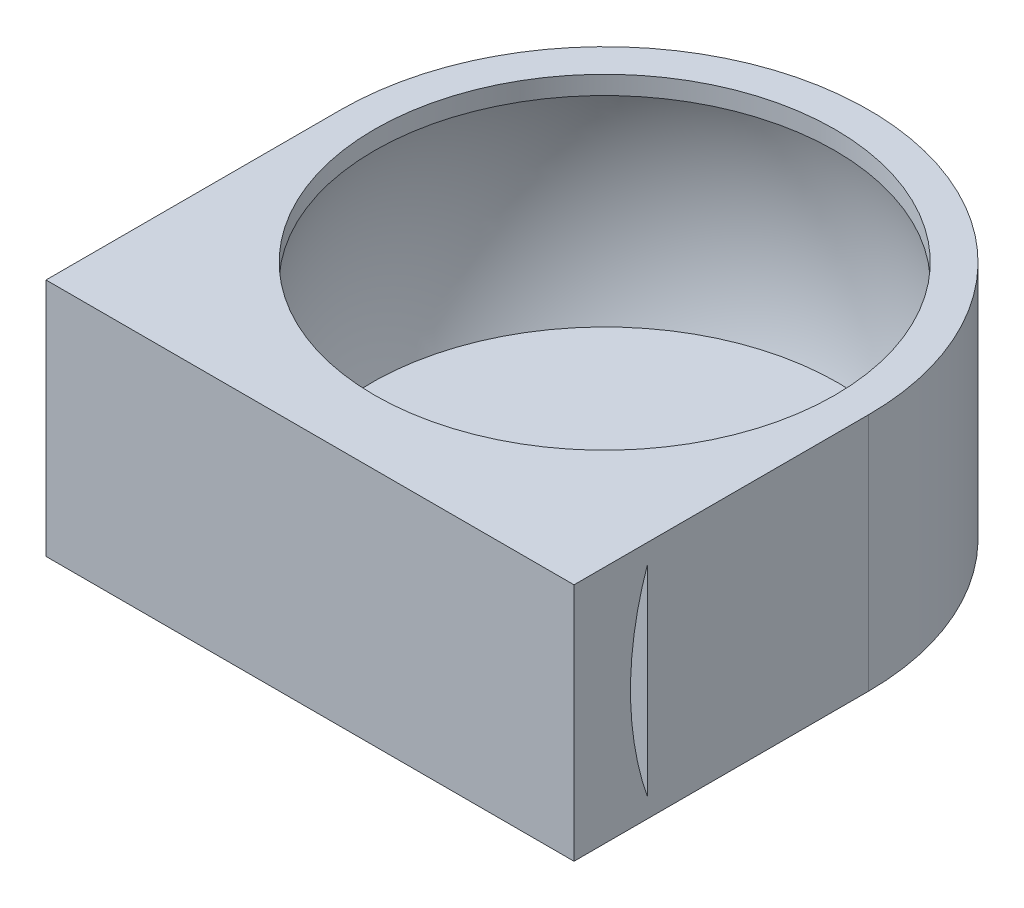
ISO-10303-21;
HEADER;
FILE_DESCRIPTION(('STEP AP214'),'2;1');
FILE_NAME('part.step','',(''),(''),'','','');
FILE_SCHEMA(('AUTOMOTIVE_DESIGN { 1 0 10303 214 1 1 1 1 }'));
ENDSEC;
DATA;
#1=APPLICATION_CONTEXT('core data for automotive mechanical design processes');
#2=APPLICATION_PROTOCOL_DEFINITION('international standard','automotive_design',2000,#1);
#3=PRODUCT_CONTEXT('',#1,'mechanical');
#4=PRODUCT('Part','Part','',(#3));
#5=PRODUCT_RELATED_PRODUCT_CATEGORY('part','',(#4));
#6=PRODUCT_DEFINITION_FORMATION('','',#4);
#7=PRODUCT_DEFINITION_CONTEXT('part definition',#1,'design');
#8=PRODUCT_DEFINITION('design','',#6,#7);
#9=PRODUCT_DEFINITION_SHAPE('','',#8);
#10=(LENGTH_UNIT() NAMED_UNIT(*) SI_UNIT(.MILLI.,.METRE.));
#11=(NAMED_UNIT(*) PLANE_ANGLE_UNIT() SI_UNIT($,.RADIAN.));
#12=(NAMED_UNIT(*) SI_UNIT($,.STERADIAN.) SOLID_ANGLE_UNIT());
#13=UNCERTAINTY_MEASURE_WITH_UNIT(LENGTH_MEASURE(1.E-05),#10,'distance_accuracy_value','');
#14=(GEOMETRIC_REPRESENTATION_CONTEXT(3) GLOBAL_UNCERTAINTY_ASSIGNED_CONTEXT((#13)) GLOBAL_UNIT_ASSIGNED_CONTEXT((#10,
#11,#12)) REPRESENTATION_CONTEXT('',''));
#15=CARTESIAN_POINT('',(0.,0.,0.));
#16=DIRECTION('',(0.,0.,1.));
#17=DIRECTION('',(1.,0.,0.));
#18=AXIS2_PLACEMENT_3D('',#15,#16,#17);
#19=CARTESIAN_POINT('',(0.,16.,0.));
#20=DIRECTION('',(0.,-1.,0.));
#21=DIRECTION('',(0.,0.,-1.));
#22=AXIS2_PLACEMENT_3D('',#19,#20,#21);
#23=DEGENERATE_TOROIDAL_SURFACE('',#22,9.19904660054057,50.,.F.);
#24=CARTESIAN_POINT('',(0.,-0.5,0.));
#25=DIRECTION('',(0.,-1.,0.));
#26=DIRECTION('',(0.,0.,-1.));
#27=AXIS2_PLACEMENT_3D('',#24,#25,#26);
#28=CIRCLE('',#27,38.);
#29=CARTESIAN_POINT('',(12.1655250605964,-0.5,36.));
#30=VERTEX_POINT('',#29);
#31=EDGE_CURVE('E106',#30,#30,#28,.T.);
#32=ORIENTED_EDGE('',*,*,#31,.T.);
#33=CARTESIAN_POINT('',(19.2020258906413,16.,36.));
#34=CARTESIAN_POINT('',(19.2020310457003,16.6057772933491,36.));
#35=CARTESIAN_POINT('',(19.1786348506415,17.2114373889956,36.));
#36=CARTESIAN_POINT('',(19.0851223311847,18.4192845924178,36.));
#37=CARTESIAN_POINT('',(19.015000030516,19.0214712460015,36.));
#38=CARTESIAN_POINT('',(18.8281585129186,20.2189906502389,36.));
#39=CARTESIAN_POINT('',(18.7114070435231,20.8143183628509,36.));
#40=CARTESIAN_POINT('',(18.4316559780078,21.9940034547397,36.));
#41=CARTESIAN_POINT('',(18.2686578131995,22.5783611729354,36.));
#42=CARTESIAN_POINT('',(17.8966662842177,23.7331064868995,36.));
#43=CARTESIAN_POINT('',(17.6876132534174,24.3034748835193,36.));
#44=CARTESIAN_POINT('',(17.224394446501,25.4253719148372,36.));
#45=CARTESIAN_POINT('',(16.9702448647637,25.9769072280827,36.));
#46=CARTESIAN_POINT('',(16.4175190451533,27.0576373772618,36.));
#47=CARTESIAN_POINT('',(16.1189200989225,27.5868206154913,36.));
#48=CARTESIAN_POINT('',(15.4786515673055,28.6181944875166,36.));
#49=CARTESIAN_POINT('',(15.1369992192345,29.120395809933,36.));
#50=CARTESIAN_POINT('',(14.4005366008495,30.1090713047297,36.));
#51=CARTESIAN_POINT('',(14.0043925660099,30.5945543133251,36.));
#52=CARTESIAN_POINT('',(13.1698473486968,31.5274064187738,36.));
#53=CARTESIAN_POINT('',(12.7314649283707,31.9747922734061,36.));
#54=CARTESIAN_POINT('',(11.8148015711599,32.8266630259533,36.));
#55=CARTESIAN_POINT('',(11.336522536994,33.2311499676828,36.));
#56=CARTESIAN_POINT('',(10.3431880469997,33.9921255936865,36.));
#57=CARTESIAN_POINT('',(9.8281373698027,34.3486204974179,36.));
#58=CARTESIAN_POINT('',(8.81556469579062,34.9772871848256,36.));
#59=CARTESIAN_POINT('',(8.32101446462476,35.2542499469128,36.));
#60=CARTESIAN_POINT('',(7.30841864839705,35.7611783230764,36.));
#61=CARTESIAN_POINT('',(6.79037685567763,35.9911514901117,36.));
#62=CARTESIAN_POINT('',(5.7351622215878,36.4007375245693,36.));
#63=CARTESIAN_POINT('',(5.19800376453149,36.5803873910334,36.));
#64=CARTESIAN_POINT('',(4.10880710859047,36.886787734938,36.));
#65=CARTESIAN_POINT('',(3.55677046416693,37.0135437160555,36.));
#66=CARTESIAN_POINT('',(2.5027795770476,37.2014437861316,36.));
#67=CARTESIAN_POINT('',(2.00181433111471,37.2681726250191,36.));
#68=CARTESIAN_POINT('',(0.995958073071651,37.3569696381367,36.));
#69=CARTESIAN_POINT('',(0.491067394281339,37.3790415636221,36.));
#70=CARTESIAN_POINT('',(-0.518537517793075,37.3782244643305,36.));
#71=CARTESIAN_POINT('',(-1.0232517624426,37.355347321312,36.));
#72=CARTESIAN_POINT('',(-2.02866447753262,37.2649714713521,36.));
#73=CARTESIAN_POINT('',(-2.52936298915714,37.1974732226236,36.));
#74=CARTESIAN_POINT('',(-3.49845824206951,37.023167868982,36.));
#75=CARTESIAN_POINT('',(-3.96723360102951,36.9184543989569,36.));
#76=CARTESIAN_POINT('',(-4.89471025013053,36.6707076150309,36.));
#77=CARTESIAN_POINT('',(-5.35340799297806,36.5276610346019,36.));
#78=CARTESIAN_POINT('',(-6.25761011427886,36.2048906946893,36.));
#79=CARTESIAN_POINT('',(-6.7031165216229,36.0251726093668,36.));
#80=CARTESIAN_POINT('',(-7.57846100241884,35.6309177364834,36.));
#81=CARTESIAN_POINT('',(-8.00829782983967,35.4163781873147,36.));
#82=CARTESIAN_POINT('',(-8.86609271821652,34.9457392840267,36.));
#83=CARTESIAN_POINT('',(-9.29335076801636,34.6883646803351,36.));
#84=CARTESIAN_POINT('',(-10.1262889567695,34.1408112382138,36.));
#85=CARTESIAN_POINT('',(-10.531968213308,33.8506310597903,36.));
#86=CARTESIAN_POINT('',(-11.3198794915532,33.240007061729,36.));
#87=CARTESIAN_POINT('',(-11.7021102609797,32.9195616280746,36.));
#88=CARTESIAN_POINT('',(-12.4416468038312,32.2508725543998,36.));
#89=CARTESIAN_POINT('',(-12.7989431112084,31.9026184636082,36.));
#90=CARTESIAN_POINT('',(-13.5192148639272,31.1473072663814,36.));
#91=CARTESIAN_POINT('',(-13.8796171507483,30.7377946265215,36.));
#92=CARTESIAN_POINT('',(-14.5675430087174,29.8918187213419,36.));
#93=CARTESIAN_POINT('',(-14.8950541256043,29.4553453476021,36.));
#94=CARTESIAN_POINT('',(-15.5158788510139,28.5587514749859,36.));
#95=CARTESIAN_POINT('',(-15.8091930468688,28.0986313824375,36.));
#96=CARTESIAN_POINT('',(-16.3607692409398,27.1576544290779,36.));
#97=CARTESIAN_POINT('',(-16.6190186507655,26.6767902022527,36.));
#98=CARTESIAN_POINT('',(-17.1238084705346,25.6480542288699,36.));
#99=CARTESIAN_POINT('',(-17.366545861077,25.0983134367653,36.));
#100=CARTESIAN_POINT('',(-17.8076605590503,23.9813030677111,36.));
#101=CARTESIAN_POINT('',(-18.0060345886711,23.4140321990646,36.));
#102=CARTESIAN_POINT('',(-18.3578651268353,22.2654666364258,36.));
#103=CARTESIAN_POINT('',(-18.5113020636536,21.6841659508918,36.));
#104=CARTESIAN_POINT('',(-18.7726463416149,20.5116116457317,36.));
#105=CARTESIAN_POINT('',(-18.8805664397573,19.9203608631927,36.));
#106=CARTESIAN_POINT('',(-19.0568125768183,18.6880840153806,36.));
#107=CARTESIAN_POINT('',(-19.1216920772801,18.0465626888334,36.));
#108=CARTESIAN_POINT('',(-19.1985664760207,16.7603600020624,36.));
#109=CARTESIAN_POINT('',(-19.210560143055,16.1156785686173,36.));
#110=CARTESIAN_POINT('',(-19.1816206769267,14.8273477199929,36.));
#111=CARTESIAN_POINT('',(-19.14067513723,14.1836985821353,36.));
#112=CARTESIAN_POINT('',(-19.0059683578127,12.9019605625643,36.));
#113=CARTESIAN_POINT('',(-18.912208002071,12.2638715879702,36.));
#114=CARTESIAN_POINT('',(-18.669137142463,10.9816080560534,36.));
#115=CARTESIAN_POINT('',(-18.518481784378,10.3376876845696,36.));
#116=CARTESIAN_POINT('',(-18.1625718945964,9.06537379604852,36.));
#117=CARTESIAN_POINT('',(-17.9573388316294,8.43697427970828,36.));
#118=CARTESIAN_POINT('',(-17.4928927845747,7.2000553506321,36.));
#119=CARTESIAN_POINT('',(-17.2336523044851,6.59154624768481,36.));
#120=CARTESIAN_POINT('',(-16.6624212452572,5.40012081151381,36.));
#121=CARTESIAN_POINT('',(-16.3504556651347,4.81719251366825,36.));
#122=CARTESIAN_POINT('',(-15.6852377881774,3.6990257846357,36.));
#123=CARTESIAN_POINT('',(-15.3335120802379,3.16287977282287,36.));
#124=CARTESIAN_POINT('',(-14.5834184502506,2.1245924882465,36.));
#125=CARTESIAN_POINT('',(-14.1850726457124,1.62243526755772,36.));
#126=CARTESIAN_POINT('',(-13.3436909023628,0.657093303386652,36.));
#127=CARTESIAN_POINT('',(-12.9006593108956,0.193904776784683,36.));
#128=CARTESIAN_POINT('',(-11.9724765483436,-0.688174618883414,36.));
#129=CARTESIAN_POINT('',(-11.4873298082683,-1.10707013783413,36.));
#130=CARTESIAN_POINT('',(-10.5212980737313,-1.86147191619371,36.));
#131=CARTESIAN_POINT('',(-10.0435870115926,-2.20104449096194,36.));
#132=CARTESIAN_POINT('',(-9.05877731954651,-2.83444234932587,36.));
#133=CARTESIAN_POINT('',(-8.55168358465904,-3.12827522305109,36.));
#134=CARTESIAN_POINT('',(-7.51213129954466,-3.66606785847515,36.));
#135=CARTESIAN_POINT('',(-6.97969146062403,-3.91006372844616,36.));
#136=CARTESIAN_POINT('',(-5.89348991511576,-4.34478808852486,36.));
#137=CARTESIAN_POINT('',(-5.33973079069959,-4.53552300659677,36.));
#138=CARTESIAN_POINT('',(-4.27862828195593,-4.84251389496441,36.));
#139=CARTESIAN_POINT('',(-3.77299500133515,-4.96470341271397,36.));
#140=CARTESIAN_POINT('',(-2.75277119549913,-5.16295392641704,36.));
#141=CARTESIAN_POINT('',(-2.23818142976298,-5.23901881416532,36.));
#142=CARTESIAN_POINT('',(-1.20442515993808,-5.34391816015698,36.));
#143=CARTESIAN_POINT('',(-0.685260652670598,-5.37277228933131,36.));
#144=CARTESIAN_POINT('',(0.353527497047721,-5.38288907550793,36.));
#145=CARTESIAN_POINT('',(0.873151122734077,-5.3641534038206,36.));
#146=CARTESIAN_POINT('',(1.87152011033415,-5.2824054065093,36.));
#147=CARTESIAN_POINT('',(2.35053569874671,-5.22264918817279,36.));
#148=CARTESIAN_POINT('',(3.30185533031695,-5.0630898896812,36.));
#149=CARTESIAN_POINT('',(3.77415928041526,-4.96328625481366,36.));
#150=CARTESIAN_POINT('',(4.70881773788836,-4.72483097941358,36.));
#151=CARTESIAN_POINT('',(5.17117262463391,-4.58618082298624,36.));
#152=CARTESIAN_POINT('',(6.08301711385637,-4.27160635912483,36.));
#153=CARTESIAN_POINT('',(6.53250631537181,-4.09568089143132,36.));
#154=CARTESIAN_POINT('',(7.42252429951935,-3.70555313063083,36.));
#155=CARTESIAN_POINT('',(7.86282025870618,-3.49082027660547,36.));
#156=CARTESIAN_POINT('',(8.72509770435343,-3.02701490532951,36.));
#157=CARTESIAN_POINT('',(9.14707299514659,-2.77793088834891,36.));
#158=CARTESIAN_POINT('',(9.97035757498657,-2.24786066069178,36.));
#159=CARTESIAN_POINT('',(10.3716703958397,-1.96687992856485,36.));
#160=CARTESIAN_POINT('',(11.1520285209999,-1.37529112811645,36.));
#161=CARTESIAN_POINT('',(11.5310653523474,-1.06467190276804,36.));
#162=CARTESIAN_POINT('',(12.2954763878964,-0.389557939860087,36.));
#163=CARTESIAN_POINT('',(12.6787931982912,-0.0227326056363834,36.));
#164=CARTESIAN_POINT('',(13.4158280857092,0.739750638466436,36.));
#165=CARTESIAN_POINT('',(13.7695350727556,1.1354192483423,36.));
#166=CARTESIAN_POINT('',(14.4459006305312,1.95252477806954,36.));
#167=CARTESIAN_POINT('',(14.7685550564841,2.37396512558964,36.));
#168=CARTESIAN_POINT('',(15.3817590624581,3.23978190616565,36.));
#169=CARTESIAN_POINT('',(15.672296837165,3.68416668557371,36.));
#170=CARTESIAN_POINT('',(16.2485272531455,4.63983169776703,36.));
#171=CARTESIAN_POINT('',(16.5306249274475,5.15328248694689,36.));
#172=CARTESIAN_POINT('',(17.0536007526307,6.20098912907179,36.));
#173=CARTESIAN_POINT('',(17.294461519254,6.73525364052811,36.));
#174=CARTESIAN_POINT('',(17.7338991751329,7.820441996062,36.));
#175=CARTESIAN_POINT('',(17.932507084175,8.37135327725957,36.));
#176=CARTESIAN_POINT('',(18.2870877161819,9.48676400319322,36.));
#177=CARTESIAN_POINT('',(18.4430523633796,10.0512659997408,36.));
#178=CARTESIAN_POINT('',(18.7851646816936,11.5011774679944,36.));
#179=CARTESIAN_POINT('',(18.9414313628985,12.393799066886,36.));
#180=CARTESIAN_POINT('',(19.1498562014607,14.1910344716028,36.));
#181=CARTESIAN_POINT('',(19.2020181947624,15.0956478343312,36.));
#182=CARTESIAN_POINT('',(19.2020258906413,16.,36.));
#183=B_SPLINE_CURVE_WITH_KNOTS('',3,(#33,#34,#35,#36,#37,#38,#39,#40,#41,#42,#43,#44,#45,#46,
#47,#48,#49,#50,#51,#52,#53,#54,#55,#56,#57,#58,#59,#60,#61,#62,#63,#64,#65,#66,#67,#68,#69,#70,
#71,#72,#73,#74,#75,#76,#77,#78,#79,#80,#81,#82,#83,#84,#85,#86,#87,#88,#89,#90,#91,#92,#93,#94,
#95,#96,#97,#98,#99,#100,#101,#102,#103,#104,#105,#106,#107,#108,#109,#110,#111,#112,#113,#114,
#115,#116,#117,#118,#119,#120,#121,#122,#123,#124,#125,#126,#127,#128,#129,#130,#131,#132,#133,
#134,#135,#136,#137,#138,#139,#140,#141,#142,#143,#144,#145,#146,#147,#148,#149,#150,#151,#152,
#153,#154,#155,#156,#157,#158,#159,#160,#161,#162,#163,#164,#165,#166,#167,#168,#169,#170,#171,
#172,#173,#174,#175,#176,#177,#178,#179,#180,#181,#182),.UNSPECIFIED.,.T.,.F.,(4,2,2,2,2,2,2,2,
2,2,2,2,2,2,2,2,2,2,2,2,2,2,2,2,2,2,2,2,2,2,2,2,2,2,2,2,2,2,2,2,2,2,2,2,2,2,2,2,2,2,2,2,2,2,2,2,
2,2,2,2,2,2,2,2,2,2,2,2,2,2,2,2,2,2,4),(0.,1.81667705231358,3.63358650229733,5.45175485484635,
7.26986694216211,9.09034849320725,10.9101776191455,12.730939673286,14.5509750502704,
16.4282434746547,18.3046818337628,20.1810307543205,22.0571362776472,23.7552769073226,
25.4531443681478,27.1497602150124,28.8461994827646,30.3604353157575,31.8745439451285,
33.3882523915075,34.9019452938958,36.3412880449251,37.7811295761671,39.2207484902532,
40.6604816329475,42.1552543336623,43.6500881127286,45.1450016548915,46.6404796687128,
48.275309048714,49.9107551421659,51.5461731426885,53.182176720772,54.9830579779074,
56.784072250173,58.5858697665772,60.3871619572784,62.3193318866357,64.2515467989508,
66.1842146163529,68.1168500870243,70.0983603341712,72.0790922828606,74.0608351276972,
76.0416409739126,77.9627845088375,79.8830202814199,81.8030694199678,83.7229167910134,
85.4788181706351,87.2344278614462,88.9887610174072,90.7428823545967,92.3013967046397,
93.8597795357468,95.4175128823802,96.9751915235962,98.4216771073717,99.8681827276777,
101.314633092744,102.761128487731,104.229145728636,105.697655615685,107.165913653414,
108.634726594923,110.22472725658,111.815320792626,113.406126341378,114.997514701407,
116.753150352808,118.509524315394,120.264604358294,122.020016547825,124.732195403767,
127.444274322238),.UNSPECIFIED.);
#184=CARTESIAN_POINT('',(12.1655250605964,32.5,36.));
#185=VERTEX_POINT('',#184);
#186=EDGE_CURVE('E162',#30,#185,#183,.T.);
#187=ORIENTED_EDGE('',*,*,#186,.T.);
#188=CARTESIAN_POINT('',(0.,32.5,0.));
#189=DIRECTION('',(0.,-1.,0.));
#190=DIRECTION('',(0.,0.,-1.));
#191=AXIS2_PLACEMENT_3D('',#188,#189,#190);
#192=CIRCLE('',#191,38.);
#193=EDGE_CURVE('E151',#185,#185,#192,.T.);
#194=ORIENTED_EDGE('',*,*,#193,.F.);
#195=CARTESIAN_POINT('',(12.1655135662837,-0.5002,35.999930082858));
#196=CARTESIAN_POINT('',(12.1981886802486,0.0683715820743591,36.1986932703389));
#197=CARTESIAN_POINT('',(12.2290477989198,0.640554682853651,36.3871928457296));
#198=CARTESIAN_POINT('',(12.2871724354531,1.79151175098215,36.7434389767115));
#199=CARTESIAN_POINT('',(12.3144380329798,2.37028557191311,36.9111859923594));
#200=CARTESIAN_POINT('',(12.3908923423615,4.11531285500194,37.3828990469745));
#201=CARTESIAN_POINT('',(12.4347537057476,5.29053670706069,37.6554295849631));
#202=CARTESIAN_POINT('',(12.4900507202798,7.06725540890148,38.0002596161124));
#203=CARTESIAN_POINT('',(12.5067489364216,7.66260236561813,38.1046371542375));
#204=CARTESIAN_POINT('',(12.5366361409192,8.85677456530845,38.291754862297));
#205=CARTESIAN_POINT('',(12.5498253616166,9.45559957530509,38.3744964648086));
#206=CARTESIAN_POINT('',(12.5727078477839,10.655896381548,38.5182128870964));
#207=CARTESIAN_POINT('',(12.5824012551357,11.2573680693725,38.5791885902671));
#208=CARTESIAN_POINT('',(12.598305129688,12.4622890387469,38.6793081647322));
#209=CARTESIAN_POINT('',(12.6045147228877,13.0657387783817,38.7184465575838));
#210=CARTESIAN_POINT('',(12.6192656696774,15.0590184385635,38.8114315696559));
#211=CARTESIAN_POINT('',(12.6203455875001,16.4513968475737,38.8182643781784));
#212=CARTESIAN_POINT('',(12.6040956109861,19.2317964145111,38.7157898378799));
#213=CARTESIAN_POINT('',(12.586764994249,20.6198173993163,38.6064779317231));
#214=CARTESIAN_POINT('',(12.5469301190826,22.6893362776964,38.3563242716952));
#215=CARTESIAN_POINT('',(12.531366881289,23.3764372136897,38.2587102610697));
#216=CARTESIAN_POINT('',(12.4956145865127,24.7457520280455,38.0350149127968));
#217=CARTESIAN_POINT('',(12.4754265849623,25.4279669848762,37.908940070383));
#218=CARTESIAN_POINT('',(12.4304063260674,26.7860634152644,37.6286240502114));
#219=CARTESIAN_POINT('',(12.4055763608563,27.4619478425149,37.4743967745935));
#220=CARTESIAN_POINT('',(12.351229476239,28.8065194212537,37.1380326323217));
#221=CARTESIAN_POINT('',(12.3217128683115,29.4752070478967,36.9558976204705));
#222=CARTESIAN_POINT('',(12.2707964979497,30.5364252586726,36.6430212557253));
#223=CARTESIAN_POINT('',(12.2509183114845,30.9316646532216,36.5211419392842));
#224=CARTESIAN_POINT('',(12.2094816064173,31.7185748460222,36.2677535648268));
#225=CARTESIAN_POINT('',(12.1879245662504,32.1102484523158,36.136252985546));
#226=CARTESIAN_POINT('',(12.1655135662841,32.5002,35.999930082858));
#227=B_SPLINE_CURVE_WITH_KNOTS('',3,(#195,#196,#197,#198,#199,#200,#201,#202,#203,#204,#205,
#206,#207,#208,#209,#210,#211,#212,#213,#214,#215,#216,#217,#218,#219,#220,#221,#222,#223,#224,
#225,#226),.UNSPECIFIED.,.F.,.F.,(4,2,2,2,2,2,2,2,2,2,2,2,2,2,2,4),(0.,1.80934128977595,
3.61864246166657,7.23640470942372,9.05007121470898,10.8636176015337,12.6770903750924,
14.4910178999314,18.6628557649788,22.8348573324246,24.9168667772496,26.9984015525001,
29.0789111983952,31.1592826294895,32.4014101420254,33.6424559170098),.UNSPECIFIED.);
#228=EDGE_CURVE('E73',#30,#185,#227,.T.);
#229=ORIENTED_EDGE('',*,*,#228,.F.);
#230=EDGE_LOOP('',(#32,#187,#194,#229));
#231=FACE_BOUND('',#230,.T.);
#232=ADVANCED_FACE('F41',(#231),#23,.T.);
#233=CARTESIAN_POINT('',(43.,-101.988578017961,0.));
#234=DIRECTION('',(-1.,0.,0.));
#235=DIRECTION('',(0.,0.,1.));
#236=AXIS2_PLACEMENT_3D('',#233,#234,#235);
#237=PLANE('',#236);
#238=DIRECTION('',(0.,0.,1.));
#239=VECTOR('',#238,1.);
#240=CARTESIAN_POINT('',(43.,-3.49999999999999,0.));
#241=LINE('',#240,#239);
#242=CARTESIAN_POINT('',(43.,-3.49999999999999,0.));
#243=VERTEX_POINT('',#242);
#244=CARTESIAN_POINT('',(43.,-3.49999999999999,48.));
#245=VERTEX_POINT('',#244);
#246=EDGE_CURVE('E130',#243,#245,#241,.T.);
#247=ORIENTED_EDGE('',*,*,#246,.F.);
#248=DIRECTION('',(0.,1.,0.));
#249=VECTOR('',#248,1.);
#250=CARTESIAN_POINT('',(43.,-101.988578017961,0.));
#251=LINE('',#250,#249);
#252=CARTESIAN_POINT('',(43.,35.5,0.));
#253=VERTEX_POINT('',#252);
#254=EDGE_CURVE('E94',#243,#253,#251,.T.);
#255=ORIENTED_EDGE('',*,*,#254,.T.);
#256=DIRECTION('',(0.,0.,1.));
#257=VECTOR('',#256,1.);
#258=CARTESIAN_POINT('',(43.,35.5,0.));
#259=LINE('',#258,#257);
#260=CARTESIAN_POINT('',(43.,35.5,48.));
#261=VERTEX_POINT('',#260);
#262=EDGE_CURVE('E123',#253,#261,#259,.T.);
#263=ORIENTED_EDGE('',*,*,#262,.T.);
#264=DIRECTION('',(0.,1.,0.));
#265=VECTOR('',#264,1.);
#266=CARTESIAN_POINT('',(43.,-101.988578017961,48.));
#267=LINE('',#266,#265);
#268=EDGE_CURVE('E133',#245,#261,#267,.T.);
#269=ORIENTED_EDGE('',*,*,#268,.F.);
#270=EDGE_LOOP('',(#247,#255,#263,#269));
#271=FACE_BOUND('',#270,.T.);
#272=DIRECTION('',(0.,-1.,0.));
#273=VECTOR('',#272,1.);
#274=CARTESIAN_POINT('',(43.,0.,36.));
#275=LINE('',#274,#273);
#276=CARTESIAN_POINT('',(43.,-0.500000000000007,36.));
#277=VERTEX_POINT('',#276);
#278=CARTESIAN_POINT('',(43.,32.5,36.));
#279=VERTEX_POINT('',#278);
#280=EDGE_CURVE('E11',#277,#279,#275,.F.);
#281=ORIENTED_EDGE('',*,*,#280,.F.);
#282=CARTESIAN_POINT('',(43.,16.,-11.1990466005406));
#283=DIRECTION('',(1.,0.,0.));
#284=DIRECTION('',(0.,0.,-1.));
#285=AXIS2_PLACEMENT_3D('',#282,#283,#284);
#286=CIRCLE('',#285,50.);
#287=EDGE_CURVE('E51',#277,#279,#286,.F.);
#288=ORIENTED_EDGE('',*,*,#287,.T.);
#289=EDGE_LOOP('',(#281,#288));
#290=FACE_BOUND('',#289,.T.);
#291=ADVANCED_FACE('F157',(#271,#290),#237,.F.);
#292=CARTESIAN_POINT('',(0.,-3.49999999999999,0.));
#293=DIRECTION('',(0.,-1.,0.));
#294=DIRECTION('',(0.,0.,-1.));
#295=AXIS2_PLACEMENT_3D('',#292,#293,#294);
#296=PLANE('',#295);
#297=CARTESIAN_POINT('',(0.,-3.49999999999999,0.));
#298=DIRECTION('',(0.,-1.,0.));
#299=DIRECTION('',(0.,0.,-1.));
#300=AXIS2_PLACEMENT_3D('',#297,#298,#299);
#301=CIRCLE('',#300,43.);
#302=CARTESIAN_POINT('',(-43.,-3.49999999999999,0.));
#303=VERTEX_POINT('',#302);
#304=EDGE_CURVE('E97',#303,#243,#301,.T.);
#305=ORIENTED_EDGE('',*,*,#304,.T.);
#306=ORIENTED_EDGE('',*,*,#246,.T.);
#307=DIRECTION('',(1.,0.,0.));
#308=VECTOR('',#307,1.);
#309=CARTESIAN_POINT('',(0.,-3.49999999999999,48.));
#310=LINE('',#309,#308);
#311=CARTESIAN_POINT('',(-43.,-3.49999999999999,48.));
#312=VERTEX_POINT('',#311);
#313=EDGE_CURVE('E113',#312,#245,#310,.T.);
#314=ORIENTED_EDGE('',*,*,#313,.F.);
#315=DIRECTION('',(0.,0.,1.));
#316=VECTOR('',#315,1.);
#317=CARTESIAN_POINT('',(-43.,-3.49999999999999,0.));
#318=LINE('',#317,#316);
#319=EDGE_CURVE('E110',#303,#312,#318,.T.);
#320=ORIENTED_EDGE('',*,*,#319,.F.);
#321=EDGE_LOOP('',(#305,#306,#314,#320));
#322=FACE_BOUND('',#321,.T.);
#323=ADVANCED_FACE('F111',(#322),#296,.T.);
#324=CARTESIAN_POINT('',(0.,-0.5,0.));
#325=DIRECTION('',(0.,-1.,0.));
#326=DIRECTION('',(0.,0.,-1.));
#327=AXIS2_PLACEMENT_3D('',#324,#325,#326);
#328=CYLINDRICAL_SURFACE('',#327,43.);
#329=ORIENTED_EDGE('',*,*,#254,.F.);
#330=ORIENTED_EDGE('',*,*,#304,.F.);
#331=DIRECTION('',(0.,1.,0.));
#332=VECTOR('',#331,1.);
#333=CARTESIAN_POINT('',(-43.,-101.988578017961,0.));
#334=LINE('',#333,#332);
#335=CARTESIAN_POINT('',(-43.,35.5,0.));
#336=VERTEX_POINT('',#335);
#337=EDGE_CURVE('E101',#303,#336,#334,.T.);
#338=ORIENTED_EDGE('',*,*,#337,.T.);
#339=CARTESIAN_POINT('',(0.,35.5,0.));
#340=DIRECTION('',(0.,-1.,0.));
#341=DIRECTION('',(0.,0.,-1.));
#342=AXIS2_PLACEMENT_3D('',#339,#340,#341);
#343=CIRCLE('',#342,43.);
#344=EDGE_CURVE('E107',#336,#253,#343,.T.);
#345=ORIENTED_EDGE('',*,*,#344,.T.);
#346=EDGE_LOOP('',(#329,#330,#338,#345));
#347=FACE_BOUND('',#346,.T.);
#348=ADVANCED_FACE('F99',(#347),#328,.T.);
#349=CARTESIAN_POINT('',(0.,35.5,0.));
#350=DIRECTION('',(0.,-1.,0.));
#351=DIRECTION('',(0.,0.,-1.));
#352=AXIS2_PLACEMENT_3D('',#349,#350,#351);
#353=PLANE('',#352);
#354=CARTESIAN_POINT('',(0.,35.5,0.));
#355=DIRECTION('',(0.,1.,0.));
#356=DIRECTION('',(0.,0.,1.));
#357=AXIS2_PLACEMENT_3D('',#354,#355,#356);
#358=CIRCLE('',#357,37.5);
#359=CARTESIAN_POINT('',(0.,35.5,37.5));
#360=VERTEX_POINT('',#359);
#361=EDGE_CURVE('E138',#360,#360,#358,.T.);
#362=ORIENTED_EDGE('',*,*,#361,.F.);
#363=EDGE_LOOP('',(#362));
#364=FACE_BOUND('',#363,.T.);
#365=ORIENTED_EDGE('',*,*,#344,.F.);
#366=DIRECTION('',(0.,0.,1.));
#367=VECTOR('',#366,1.);
#368=CARTESIAN_POINT('',(-43.,35.5,0.));
#369=LINE('',#368,#367);
#370=CARTESIAN_POINT('',(-43.,35.5,48.));
#371=VERTEX_POINT('',#370);
#372=EDGE_CURVE('E121',#336,#371,#369,.T.);
#373=ORIENTED_EDGE('',*,*,#372,.T.);
#374=DIRECTION('',(1.,0.,0.));
#375=VECTOR('',#374,1.);
#376=CARTESIAN_POINT('',(0.,35.5,48.));
#377=LINE('',#376,#375);
#378=EDGE_CURVE('E225',#371,#261,#377,.T.);
#379=ORIENTED_EDGE('',*,*,#378,.T.);
#380=ORIENTED_EDGE('',*,*,#262,.F.);
#381=EDGE_LOOP('',(#365,#373,#379,#380));
#382=FACE_BOUND('',#381,.T.);
#383=ADVANCED_FACE('F200',(#364,#382),#353,.F.);
#384=CARTESIAN_POINT('',(0.,32.5,0.));
#385=DIRECTION('',(0.,1.,0.));
#386=DIRECTION('',(0.,0.,1.));
#387=AXIS2_PLACEMENT_3D('',#384,#385,#386);
#388=CYLINDRICAL_SURFACE('',#387,37.5);
#389=CARTESIAN_POINT('',(0.,32.5,0.));
#390=DIRECTION('',(0.,1.,0.));
#391=DIRECTION('',(0.,0.,1.));
#392=AXIS2_PLACEMENT_3D('',#389,#390,#391);
#393=CIRCLE('',#392,37.5);
#394=CARTESIAN_POINT('',(0.,32.5,37.5));
#395=VERTEX_POINT('',#394);
#396=EDGE_CURVE('E139',#395,#395,#393,.T.);
#397=ORIENTED_EDGE('',*,*,#396,.F.);
#398=EDGE_LOOP('',(#397));
#399=FACE_BOUND('',#398,.T.);
#400=ORIENTED_EDGE('',*,*,#361,.T.);
#401=EDGE_LOOP('',(#400));
#402=FACE_BOUND('',#401,.T.);
#403=ADVANCED_FACE('F197',(#399,#402),#388,.F.);
#404=CARTESIAN_POINT('',(0.,32.5,0.));
#405=DIRECTION('',(0.,-1.,0.));
#406=DIRECTION('',(0.,0.,-1.));
#407=AXIS2_PLACEMENT_3D('',#404,#405,#406);
#408=PLANE('',#407);
#409=ORIENTED_EDGE('',*,*,#396,.T.);
#410=EDGE_LOOP('',(#409));
#411=FACE_BOUND('',#410,.T.);
#412=ORIENTED_EDGE('',*,*,#193,.T.);
#413=EDGE_LOOP('',(#412));
#414=FACE_BOUND('',#413,.T.);
#415=ADVANCED_FACE('F43',(#411,#414),#408,.T.);
#416=CARTESIAN_POINT('',(0.,-0.5,0.));
#417=DIRECTION('',(0.,-1.,0.));
#418=DIRECTION('',(0.,0.,-1.));
#419=AXIS2_PLACEMENT_3D('',#416,#417,#418);
#420=PLANE('',#419);
#421=ORIENTED_EDGE('',*,*,#31,.F.);
#422=EDGE_LOOP('',(#421));
#423=FACE_BOUND('',#422,.T.);
#424=ADVANCED_FACE('F195',(#423),#420,.F.);
#425=CARTESIAN_POINT('',(0.,-101.988578017961,48.));
#426=DIRECTION('',(0.,0.,1.));
#427=DIRECTION('',(1.,0.,0.));
#428=AXIS2_PLACEMENT_3D('',#425,#426,#427);
#429=PLANE('',#428);
#430=DIRECTION('',(0.,1.,0.));
#431=VECTOR('',#430,1.);
#432=CARTESIAN_POINT('',(-43.,-101.988578017961,48.));
#433=LINE('',#432,#431);
#434=EDGE_CURVE('E117',#312,#371,#433,.T.);
#435=ORIENTED_EDGE('',*,*,#434,.F.);
#436=ORIENTED_EDGE('',*,*,#313,.T.);
#437=ORIENTED_EDGE('',*,*,#268,.T.);
#438=ORIENTED_EDGE('',*,*,#378,.F.);
#439=EDGE_LOOP('',(#435,#436,#437,#438));
#440=FACE_BOUND('',#439,.T.);
#441=ADVANCED_FACE('F189',(#440),#429,.T.);
#442=CARTESIAN_POINT('',(-43.,-101.988578017961,0.));
#443=DIRECTION('',(-1.,0.,0.));
#444=DIRECTION('',(0.,0.,1.));
#445=AXIS2_PLACEMENT_3D('',#442,#443,#444);
#446=PLANE('',#445);
#447=ORIENTED_EDGE('',*,*,#337,.F.);
#448=ORIENTED_EDGE('',*,*,#319,.T.);
#449=ORIENTED_EDGE('',*,*,#434,.T.);
#450=ORIENTED_EDGE('',*,*,#372,.F.);
#451=EDGE_LOOP('',(#447,#448,#449,#450));
#452=FACE_BOUND('',#451,.T.);
#453=ADVANCED_FACE('F119',(#452),#446,.T.);
#454=CARTESIAN_POINT('',(2.99999999999998,0.,36.));
#455=DIRECTION('',(0.,0.,1.));
#456=DIRECTION('',(0.,-1.,0.));
#457=AXIS2_PLACEMENT_3D('',#454,#455,#456);
#458=PLANE('',#457);
#459=DIRECTION('',(1.,0.,0.));
#460=VECTOR('',#459,1.);
#461=CARTESIAN_POINT('',(2.99999999999998,-0.499999999999993,36.));
#462=LINE('',#461,#460);
#463=EDGE_CURVE('E58',#30,#277,#462,.T.);
#464=ORIENTED_EDGE('',*,*,#463,.T.);
#465=ORIENTED_EDGE('',*,*,#280,.T.);
#466=DIRECTION('',(1.,0.,0.));
#467=VECTOR('',#466,1.);
#468=CARTESIAN_POINT('',(2.99999999999998,32.5,36.));
#469=LINE('',#468,#467);
#470=EDGE_CURVE('E160',#185,#279,#469,.T.);
#471=ORIENTED_EDGE('',*,*,#470,.F.);
#472=ORIENTED_EDGE('',*,*,#186,.F.);
#473=EDGE_LOOP('',(#464,#465,#471,#472));
#474=FACE_BOUND('',#473,.T.);
#475=ADVANCED_FACE('F159',(#474),#458,.T.);
#476=CARTESIAN_POINT('',(2.99999999999998,16.,-11.1990466005406));
#477=DIRECTION('',(1.,0.,0.));
#478=DIRECTION('',(0.,0.,-1.));
#479=AXIS2_PLACEMENT_3D('',#476,#477,#478);
#480=CYLINDRICAL_SURFACE('',#479,50.);
#481=ORIENTED_EDGE('',*,*,#228,.T.);
#482=ORIENTED_EDGE('',*,*,#470,.T.);
#483=ORIENTED_EDGE('',*,*,#287,.F.);
#484=ORIENTED_EDGE('',*,*,#463,.F.);
#485=EDGE_LOOP('',(#481,#482,#483,#484));
#486=FACE_BOUND('',#485,.T.);
#487=ADVANCED_FACE('F181',(#486),#480,.F.);
#488=CLOSED_SHELL('',(#232,#291,#323,#348,#383,#403,#415,#424,#441,#453,#475,#487));
#489=MANIFOLD_SOLID_BREP('B2',#488);
#490=ADVANCED_BREP_SHAPE_REPRESENTATION('',(#18,#489),#14);
#491=SHAPE_DEFINITION_REPRESENTATION(#9,#490);
ENDSEC;
END-ISO-10303-21;
